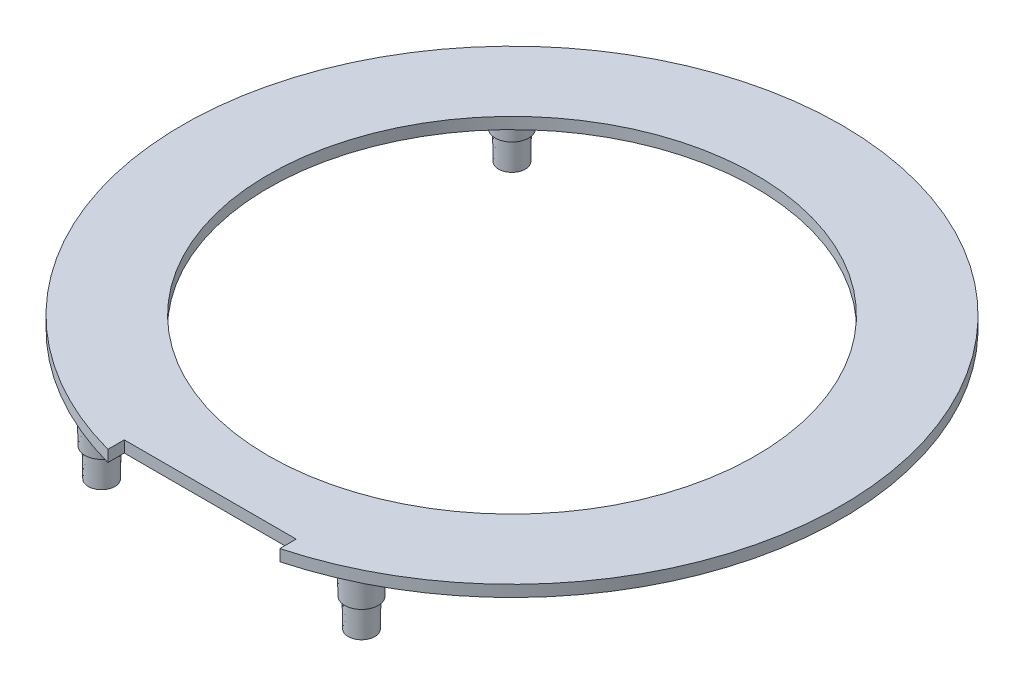
ISO-10303-21;
HEADER;
FILE_DESCRIPTION(('STEP AP214'),'2;1');
FILE_NAME('part.step','',(''),(''),'','','');
FILE_SCHEMA(('AUTOMOTIVE_DESIGN { 1 0 10303 214 1 1 1 1 }'));
ENDSEC;
DATA;
#1=APPLICATION_CONTEXT('core data for automotive mechanical design processes');
#2=APPLICATION_PROTOCOL_DEFINITION('international standard','automotive_design',2000,#1);
#3=PRODUCT_CONTEXT('',#1,'mechanical');
#4=PRODUCT('Part','Part','',(#3));
#5=PRODUCT_RELATED_PRODUCT_CATEGORY('part','',(#4));
#6=PRODUCT_DEFINITION_FORMATION('','',#4);
#7=PRODUCT_DEFINITION_CONTEXT('part definition',#1,'design');
#8=PRODUCT_DEFINITION('design','',#6,#7);
#9=PRODUCT_DEFINITION_SHAPE('','',#8);
#10=(LENGTH_UNIT() NAMED_UNIT(*) SI_UNIT(.MILLI.,.METRE.));
#11=(NAMED_UNIT(*) PLANE_ANGLE_UNIT() SI_UNIT($,.RADIAN.));
#12=(NAMED_UNIT(*) SI_UNIT($,.STERADIAN.) SOLID_ANGLE_UNIT());
#13=UNCERTAINTY_MEASURE_WITH_UNIT(LENGTH_MEASURE(1.E-05),#10,'distance_accuracy_value','');
#14=(GEOMETRIC_REPRESENTATION_CONTEXT(3) GLOBAL_UNCERTAINTY_ASSIGNED_CONTEXT((#13)) GLOBAL_UNIT_ASSIGNED_CONTEXT((#10,
#11,#12)) REPRESENTATION_CONTEXT('',''));
#15=CARTESIAN_POINT('',(0.,0.,0.));
#16=DIRECTION('',(0.,0.,1.));
#17=DIRECTION('',(1.,0.,0.));
#18=AXIS2_PLACEMENT_3D('',#15,#16,#17);
#19=CARTESIAN_POINT('',(0.,0.4,-1.53064501));
#20=DIRECTION('',(0.,1.,0.));
#21=DIRECTION('',(0.,0.,1.));
#22=AXIS2_PLACEMENT_3D('',#19,#20,#21);
#23=PLANE('',#22);
#24=DIRECTION('',(0.,0.,1.));
#25=VECTOR('',#24,1.);
#26=CARTESIAN_POINT('',(-3.,0.4,9.));
#27=LINE('',#26,#25);
#28=CARTESIAN_POINT('',(-3.,0.4,9.));
#29=VERTEX_POINT('',#28);
#30=CARTESIAN_POINT('',(-3.,0.4,9.57115664558726));
#31=VERTEX_POINT('',#30);
#32=EDGE_CURVE('E87',#29,#31,#27,.T.);
#33=ORIENTED_EDGE('',*,*,#32,.F.);
#34=DIRECTION('',(-1.,0.,0.));
#35=VECTOR('',#34,1.);
#36=CARTESIAN_POINT('',(3.,0.4,9.));
#37=LINE('',#36,#35);
#38=CARTESIAN_POINT('',(3.,0.4,9.));
#39=VERTEX_POINT('',#38);
#40=EDGE_CURVE('E95',#39,#29,#37,.T.);
#41=ORIENTED_EDGE('',*,*,#40,.F.);
#42=DIRECTION('',(0.,0.,-1.));
#43=VECTOR('',#42,1.);
#44=CARTESIAN_POINT('',(3.,0.4,9.));
#45=LINE('',#44,#43);
#46=CARTESIAN_POINT('',(3.,0.4,9.57115664558726));
#47=VERTEX_POINT('',#46);
#48=EDGE_CURVE('E80',#47,#39,#45,.T.);
#49=ORIENTED_EDGE('',*,*,#48,.F.);
#50=CARTESIAN_POINT('',(0.,0.4,-1.53064501));
#51=DIRECTION('',(0.,1.,0.));
#52=DIRECTION('',(0.,0.,1.));
#53=AXIS2_PLACEMENT_3D('',#50,#51,#52);
#54=CIRCLE('',#53,11.5);
#55=EDGE_CURVE('E93',#47,#31,#54,.T.);
#56=ORIENTED_EDGE('',*,*,#55,.T.);
#57=EDGE_LOOP('',(#33,#41,#49,#56));
#58=FACE_BOUND('',#57,.T.);
#59=CARTESIAN_POINT('',(0.,0.4,-1.53064501));
#60=DIRECTION('',(0.,1.,0.));
#61=DIRECTION('',(0.,0.,1.));
#62=AXIS2_PLACEMENT_3D('',#59,#60,#61);
#63=CIRCLE('',#62,8.5);
#64=CARTESIAN_POINT('',(0.,0.4,6.96935499));
#65=VERTEX_POINT('',#64);
#66=EDGE_CURVE('E106',#65,#65,#63,.T.);
#67=ORIENTED_EDGE('',*,*,#66,.F.);
#68=EDGE_LOOP('',(#67));
#69=FACE_BOUND('',#68,.T.);
#70=ADVANCED_FACE('F35',(#58,#69),#23,.T.);
#71=CARTESIAN_POINT('',(0.,0.,-1.53064501));
#72=DIRECTION('',(0.,1.,0.));
#73=DIRECTION('',(0.,0.,1.));
#74=AXIS2_PLACEMENT_3D('',#71,#72,#73);
#75=PLANE('',#74);
#76=CARTESIAN_POINT('',(4.45412000000001,0.,8.175151));
#77=DIRECTION('',(0.,1.,0.));
#78=DIRECTION('',(0.,0.,-1.));
#79=AXIS2_PLACEMENT_3D('',#76,#77,#78);
#80=CIRCLE('',#79,0.6);
#81=CARTESIAN_POINT('',(4.45412000000001,0.,7.57515100000001));
#82=VERTEX_POINT('',#81);
#83=EDGE_CURVE('E133',#82,#82,#80,.T.);
#84=ORIENTED_EDGE('',*,*,#83,.T.);
#85=EDGE_LOOP('',(#84));
#86=FACE_BOUND('',#85,.T.);
#87=CARTESIAN_POINT('',(7.74411999999999,0.,-8.57484900000001));
#88=DIRECTION('',(0.,1.,0.));
#89=DIRECTION('',(0.,0.,-1.));
#90=AXIS2_PLACEMENT_3D('',#87,#88,#89);
#91=CIRCLE('',#90,0.6);
#92=CARTESIAN_POINT('',(7.74411999999999,0.,-9.17484900000001));
#93=VERTEX_POINT('',#92);
#94=EDGE_CURVE('E138',#93,#93,#91,.T.);
#95=ORIENTED_EDGE('',*,*,#94,.T.);
#96=EDGE_LOOP('',(#95));
#97=FACE_BOUND('',#96,.T.);
#98=CARTESIAN_POINT('',(-7.04588,0.,-8.57484900000001));
#99=DIRECTION('',(0.,1.,0.));
#100=DIRECTION('',(0.,0.,1.));
#101=AXIS2_PLACEMENT_3D('',#98,#99,#100);
#102=CIRCLE('',#101,0.6);
#103=CARTESIAN_POINT('',(-7.04588,0.,-7.97484900000001));
#104=VERTEX_POINT('',#103);
#105=EDGE_CURVE('E128',#104,#104,#102,.T.);
#106=ORIENTED_EDGE('',*,*,#105,.T.);
#107=EDGE_LOOP('',(#106));
#108=FACE_BOUND('',#107,.T.);
#109=CARTESIAN_POINT('',(-4.61587999999999,0.,8.175151));
#110=DIRECTION('',(0.,1.,0.));
#111=DIRECTION('',(0.,0.,1.));
#112=AXIS2_PLACEMENT_3D('',#109,#110,#111);
#113=CIRCLE('',#112,0.6);
#114=CARTESIAN_POINT('',(-4.61587999999999,0.,8.775151));
#115=VERTEX_POINT('',#114);
#116=EDGE_CURVE('E127',#115,#115,#113,.T.);
#117=ORIENTED_EDGE('',*,*,#116,.T.);
#118=EDGE_LOOP('',(#117));
#119=FACE_BOUND('',#118,.T.);
#120=DIRECTION('',(1.,0.,0.));
#121=VECTOR('',#120,1.);
#122=CARTESIAN_POINT('',(3.,0.,9.));
#123=LINE('',#122,#121);
#124=CARTESIAN_POINT('',(-3.,0.,9.));
#125=VERTEX_POINT('',#124);
#126=CARTESIAN_POINT('',(3.,0.,9.));
#127=VERTEX_POINT('',#126);
#128=EDGE_CURVE('E223',#125,#127,#123,.T.);
#129=ORIENTED_EDGE('',*,*,#128,.F.);
#130=DIRECTION('',(0.,0.,-1.));
#131=VECTOR('',#130,1.);
#132=CARTESIAN_POINT('',(-3.,0.,9.));
#133=LINE('',#132,#131);
#134=CARTESIAN_POINT('',(-3.,0.,9.57115664558726));
#135=VERTEX_POINT('',#134);
#136=EDGE_CURVE('E61',#135,#125,#133,.T.);
#137=ORIENTED_EDGE('',*,*,#136,.F.);
#138=CARTESIAN_POINT('',(0.,0.,-1.53064501));
#139=DIRECTION('',(0.,1.,0.));
#140=DIRECTION('',(0.,0.,1.));
#141=AXIS2_PLACEMENT_3D('',#138,#139,#140);
#142=CIRCLE('',#141,11.5);
#143=CARTESIAN_POINT('',(3.,0.,9.57115664558726));
#144=VERTEX_POINT('',#143);
#145=EDGE_CURVE('E101',#144,#135,#142,.T.);
#146=ORIENTED_EDGE('',*,*,#145,.F.);
#147=DIRECTION('',(0.,0.,1.));
#148=VECTOR('',#147,1.);
#149=CARTESIAN_POINT('',(3.,0.,9.));
#150=LINE('',#149,#148);
#151=EDGE_CURVE('E52',#127,#144,#150,.T.);
#152=ORIENTED_EDGE('',*,*,#151,.F.);
#153=EDGE_LOOP('',(#129,#137,#146,#152));
#154=FACE_BOUND('',#153,.T.);
#155=CARTESIAN_POINT('',(0.,0.,-1.53064501));
#156=DIRECTION('',(0.,1.,0.));
#157=DIRECTION('',(0.,0.,1.));
#158=AXIS2_PLACEMENT_3D('',#155,#156,#157);
#159=CIRCLE('',#158,8.5);
#160=CARTESIAN_POINT('',(0.,0.,6.96935499));
#161=VERTEX_POINT('',#160);
#162=EDGE_CURVE('E109',#161,#161,#159,.T.);
#163=ORIENTED_EDGE('',*,*,#162,.T.);
#164=EDGE_LOOP('',(#163));
#165=FACE_BOUND('',#164,.T.);
#166=ADVANCED_FACE('F158',(#86,#97,#108,#119,#154,#165),#75,.F.);
#167=CARTESIAN_POINT('',(0.,0.4,-1.53064501));
#168=DIRECTION('',(0.,-1.,0.));
#169=DIRECTION('',(0.,0.,-1.));
#170=AXIS2_PLACEMENT_3D('',#167,#168,#169);
#171=CYLINDRICAL_SURFACE('',#170,11.5);
#172=ORIENTED_EDGE('',*,*,#145,.T.);
#173=DIRECTION('',(0.,1.,0.));
#174=VECTOR('',#173,1.);
#175=CARTESIAN_POINT('',(-3.,-6.07779969204628,9.57115664558726));
#176=LINE('',#175,#174);
#177=EDGE_CURVE('E99',#135,#31,#176,.T.);
#178=ORIENTED_EDGE('',*,*,#177,.T.);
#179=ORIENTED_EDGE('',*,*,#55,.F.);
#180=DIRECTION('',(0.,1.,0.));
#181=VECTOR('',#180,1.);
#182=CARTESIAN_POINT('',(3.,-6.07779969204628,9.57115664558726));
#183=LINE('',#182,#181);
#184=EDGE_CURVE('E77',#144,#47,#183,.T.);
#185=ORIENTED_EDGE('',*,*,#184,.F.);
#186=EDGE_LOOP('',(#172,#178,#179,#185));
#187=FACE_BOUND('',#186,.T.);
#188=ADVANCED_FACE('F98',(#187),#171,.T.);
#189=CARTESIAN_POINT('',(0.,0.4,-1.53064501));
#190=DIRECTION('',(0.,-1.,0.));
#191=DIRECTION('',(0.,0.,-1.));
#192=AXIS2_PLACEMENT_3D('',#189,#190,#191);
#193=CYLINDRICAL_SURFACE('',#192,8.5);
#194=ORIENTED_EDGE('',*,*,#66,.T.);
#195=EDGE_LOOP('',(#194));
#196=FACE_BOUND('',#195,.T.);
#197=ORIENTED_EDGE('',*,*,#162,.F.);
#198=EDGE_LOOP('',(#197));
#199=FACE_BOUND('',#198,.T.);
#200=ADVANCED_FACE('F160',(#196,#199),#193,.F.);
#201=CARTESIAN_POINT('',(-4.61587999999999,0.,8.175151));
#202=DIRECTION('',(0.,1.,0.));
#203=DIRECTION('',(0.,0.,-1.));
#204=AXIS2_PLACEMENT_3D('',#201,#202,#203);
#205=CONICAL_SURFACE('',#204,0.6,0.0174532925199433);
#206=CARTESIAN_POINT('',(-4.61587999999999,-1.,8.175151));
#207=DIRECTION('',(0.,1.,0.));
#208=DIRECTION('',(0.,0.,1.));
#209=AXIS2_PLACEMENT_3D('',#206,#207,#208);
#210=CIRCLE('',#209,0.582544935071783);
#211=CARTESIAN_POINT('',(-4.61587999999999,-1.,8.75769593507179));
#212=VERTEX_POINT('',#211);
#213=EDGE_CURVE('E129',#212,#212,#210,.T.);
#214=ORIENTED_EDGE('',*,*,#213,.T.);
#215=EDGE_LOOP('',(#214));
#216=FACE_BOUND('',#215,.T.);
#217=ORIENTED_EDGE('',*,*,#116,.F.);
#218=EDGE_LOOP('',(#217));
#219=FACE_BOUND('',#218,.T.);
#220=ADVANCED_FACE('F162',(#216,#219),#205,.T.);
#221=CARTESIAN_POINT('',(-4.61587999999999,-1.,8.175151));
#222=DIRECTION('',(0.,1.,0.));
#223=DIRECTION('',(0.,0.,1.));
#224=AXIS2_PLACEMENT_3D('',#221,#222,#223);
#225=PLANE('',#224);
#226=CARTESIAN_POINT('',(-4.61587999999999,-1.,8.175151));
#227=DIRECTION('',(0.,1.,0.));
#228=DIRECTION('',(0.,0.,1.));
#229=AXIS2_PLACEMENT_3D('',#226,#227,#228);
#230=CIRCLE('',#229,0.482544935071784);
#231=CARTESIAN_POINT('',(-4.61587999999999,-1.,8.65769593507179));
#232=VERTEX_POINT('',#231);
#233=EDGE_CURVE('E100',#232,#232,#230,.F.);
#234=ORIENTED_EDGE('',*,*,#233,.F.);
#235=EDGE_LOOP('',(#234));
#236=FACE_BOUND('',#235,.T.);
#237=ORIENTED_EDGE('',*,*,#213,.F.);
#238=EDGE_LOOP('',(#237));
#239=FACE_BOUND('',#238,.T.);
#240=ADVANCED_FACE('F168',(#236,#239),#225,.F.);
#241=CARTESIAN_POINT('',(-7.04588,0.,-8.57484900000001));
#242=DIRECTION('',(0.,1.,0.));
#243=DIRECTION('',(0.,0.,-1.));
#244=AXIS2_PLACEMENT_3D('',#241,#242,#243);
#245=CONICAL_SURFACE('',#244,0.6,0.0174532925199433);
#246=CARTESIAN_POINT('',(-7.04588,-1.,-8.57484900000001));
#247=DIRECTION('',(0.,1.,0.));
#248=DIRECTION('',(0.,0.,1.));
#249=AXIS2_PLACEMENT_3D('',#246,#247,#248);
#250=CIRCLE('',#249,0.582544935071783);
#251=CARTESIAN_POINT('',(-7.04588,-1.,-7.99230406492823));
#252=VERTEX_POINT('',#251);
#253=EDGE_CURVE('E124',#252,#252,#250,.T.);
#254=ORIENTED_EDGE('',*,*,#253,.T.);
#255=EDGE_LOOP('',(#254));
#256=FACE_BOUND('',#255,.T.);
#257=ORIENTED_EDGE('',*,*,#105,.F.);
#258=EDGE_LOOP('',(#257));
#259=FACE_BOUND('',#258,.T.);
#260=ADVANCED_FACE('F205',(#256,#259),#245,.T.);
#261=CARTESIAN_POINT('',(-7.04588,-1.,-8.57484900000001));
#262=DIRECTION('',(0.,1.,0.));
#263=DIRECTION('',(0.,0.,1.));
#264=AXIS2_PLACEMENT_3D('',#261,#262,#263);
#265=PLANE('',#264);
#266=CARTESIAN_POINT('',(-7.04588,-1.,-8.57484900000001));
#267=DIRECTION('',(0.,1.,0.));
#268=DIRECTION('',(0.,0.,1.));
#269=AXIS2_PLACEMENT_3D('',#266,#267,#268);
#270=CIRCLE('',#269,0.482544935071784);
#271=CARTESIAN_POINT('',(-7.04588,-1.,-8.09230406492822));
#272=VERTEX_POINT('',#271);
#273=EDGE_CURVE('E104',#272,#272,#270,.F.);
#274=ORIENTED_EDGE('',*,*,#273,.F.);
#275=EDGE_LOOP('',(#274));
#276=FACE_BOUND('',#275,.T.);
#277=ORIENTED_EDGE('',*,*,#253,.F.);
#278=EDGE_LOOP('',(#277));
#279=FACE_BOUND('',#278,.T.);
#280=ADVANCED_FACE('F190',(#276,#279),#265,.F.);
#281=CARTESIAN_POINT('',(7.74411999999999,0.,-8.57484900000001));
#282=DIRECTION('',(0.,1.,0.));
#283=DIRECTION('',(0.,0.,-1.));
#284=AXIS2_PLACEMENT_3D('',#281,#282,#283);
#285=CONICAL_SURFACE('',#284,0.6,0.0174532925199433);
#286=CARTESIAN_POINT('',(7.74411999999999,-1.,-8.57484900000001));
#287=DIRECTION('',(0.,-1.,0.));
#288=DIRECTION('',(0.,0.,-1.));
#289=AXIS2_PLACEMENT_3D('',#286,#287,#288);
#290=CIRCLE('',#289,0.582544935071783);
#291=CARTESIAN_POINT('',(7.74411999999999,-1.,-9.15739393507179));
#292=VERTEX_POINT('',#291);
#293=EDGE_CURVE('E39',#292,#292,#290,.F.);
#294=ORIENTED_EDGE('',*,*,#293,.T.);
#295=EDGE_LOOP('',(#294));
#296=FACE_BOUND('',#295,.T.);
#297=ORIENTED_EDGE('',*,*,#94,.F.);
#298=EDGE_LOOP('',(#297));
#299=FACE_BOUND('',#298,.T.);
#300=ADVANCED_FACE('F186',(#296,#299),#285,.T.);
#301=CARTESIAN_POINT('',(7.74411999999999,-1.,-8.57484900000001));
#302=DIRECTION('',(0.,-1.,0.));
#303=DIRECTION('',(0.,0.,-1.));
#304=AXIS2_PLACEMENT_3D('',#301,#302,#303);
#305=PLANE('',#304);
#306=CARTESIAN_POINT('',(7.74411999999999,-1.,-8.57484900000001));
#307=DIRECTION('',(0.,-1.,0.));
#308=DIRECTION('',(0.,0.,-1.));
#309=AXIS2_PLACEMENT_3D('',#306,#307,#308);
#310=CIRCLE('',#309,0.482544935071785);
#311=CARTESIAN_POINT('',(7.74411999999999,-1.,-9.0573939350718));
#312=VERTEX_POINT('',#311);
#313=EDGE_CURVE('E44',#312,#312,#310,.T.);
#314=ORIENTED_EDGE('',*,*,#313,.F.);
#315=EDGE_LOOP('',(#314));
#316=FACE_BOUND('',#315,.T.);
#317=ORIENTED_EDGE('',*,*,#293,.F.);
#318=EDGE_LOOP('',(#317));
#319=FACE_BOUND('',#318,.T.);
#320=ADVANCED_FACE('F189',(#316,#319),#305,.T.);
#321=CARTESIAN_POINT('',(4.45412000000001,0.,8.175151));
#322=DIRECTION('',(0.,1.,0.));
#323=DIRECTION('',(0.,0.,-1.));
#324=AXIS2_PLACEMENT_3D('',#321,#322,#323);
#325=CONICAL_SURFACE('',#324,0.6,0.0174532925199433);
#326=CARTESIAN_POINT('',(4.45412000000001,-1.,8.175151));
#327=DIRECTION('',(0.,-1.,0.));
#328=DIRECTION('',(0.,0.,-1.));
#329=AXIS2_PLACEMENT_3D('',#326,#327,#328);
#330=CIRCLE('',#329,0.582544935071783);
#331=CARTESIAN_POINT('',(4.45412000000001,-1.,7.59260606492822));
#332=VERTEX_POINT('',#331);
#333=EDGE_CURVE('E136',#332,#332,#330,.F.);
#334=ORIENTED_EDGE('',*,*,#333,.T.);
#335=EDGE_LOOP('',(#334));
#336=FACE_BOUND('',#335,.T.);
#337=ORIENTED_EDGE('',*,*,#83,.F.);
#338=EDGE_LOOP('',(#337));
#339=FACE_BOUND('',#338,.T.);
#340=ADVANCED_FACE('F192',(#336,#339),#325,.T.);
#341=CARTESIAN_POINT('',(4.45412000000001,-1.,8.175151));
#342=DIRECTION('',(0.,-1.,0.));
#343=DIRECTION('',(0.,0.,-1.));
#344=AXIS2_PLACEMENT_3D('',#341,#342,#343);
#345=PLANE('',#344);
#346=CARTESIAN_POINT('',(4.45412000000001,-1.,8.175151));
#347=DIRECTION('',(0.,-1.,0.));
#348=DIRECTION('',(0.,0.,-1.));
#349=AXIS2_PLACEMENT_3D('',#346,#347,#348);
#350=CIRCLE('',#349,0.482544935071784);
#351=CARTESIAN_POINT('',(4.45412000000001,-1.,7.69260606492822));
#352=VERTEX_POINT('',#351);
#353=EDGE_CURVE('E11',#352,#352,#350,.T.);
#354=ORIENTED_EDGE('',*,*,#353,.F.);
#355=EDGE_LOOP('',(#354));
#356=FACE_BOUND('',#355,.T.);
#357=ORIENTED_EDGE('',*,*,#333,.F.);
#358=EDGE_LOOP('',(#357));
#359=FACE_BOUND('',#358,.T.);
#360=ADVANCED_FACE('F195',(#356,#359),#345,.T.);
#361=CARTESIAN_POINT('',(-4.61587999999999,0.,8.175151));
#362=DIRECTION('',(0.,1.,0.));
#363=DIRECTION('',(0.,0.,-1.));
#364=AXIS2_PLACEMENT_3D('',#361,#362,#363);
#365=CONICAL_SURFACE('',#364,0.500000000000002,0.0174532925199433);
#366=CARTESIAN_POINT('',(-4.61587999999999,-2.,8.175151));
#367=DIRECTION('',(0.,-1.,0.));
#368=DIRECTION('',(0.,0.,-1.));
#369=AXIS2_PLACEMENT_3D('',#366,#367,#368);
#370=CIRCLE('',#369,0.465089870143566);
#371=CARTESIAN_POINT('',(-4.61587999999999,-2.,7.71006112985644));
#372=VERTEX_POINT('',#371);
#373=EDGE_CURVE('E121',#372,#372,#370,.T.);
#374=ORIENTED_EDGE('',*,*,#373,.F.);
#375=EDGE_LOOP('',(#374));
#376=FACE_BOUND('',#375,.T.);
#377=ORIENTED_EDGE('',*,*,#233,.T.);
#378=EDGE_LOOP('',(#377));
#379=FACE_BOUND('',#378,.T.);
#380=ADVANCED_FACE('F201',(#376,#379),#365,.T.);
#381=CARTESIAN_POINT('',(-4.61587999999999,-2.,8.175151));
#382=DIRECTION('',(0.,-1.,0.));
#383=DIRECTION('',(0.,0.,-1.));
#384=AXIS2_PLACEMENT_3D('',#381,#382,#383);
#385=PLANE('',#384);
#386=ORIENTED_EDGE('',*,*,#373,.T.);
#387=EDGE_LOOP('',(#386));
#388=FACE_BOUND('',#387,.T.);
#389=ADVANCED_FACE('F203',(#388),#385,.T.);
#390=CARTESIAN_POINT('',(-7.04588,0.,-8.57484900000001));
#391=DIRECTION('',(0.,1.,0.));
#392=DIRECTION('',(0.,0.,-1.));
#393=AXIS2_PLACEMENT_3D('',#390,#391,#392);
#394=CONICAL_SURFACE('',#393,0.500000000000002,0.0174532925199433);
#395=CARTESIAN_POINT('',(-7.04588,-2.,-8.57484900000001));
#396=DIRECTION('',(0.,-1.,0.));
#397=DIRECTION('',(0.,0.,-1.));
#398=AXIS2_PLACEMENT_3D('',#395,#396,#397);
#399=CIRCLE('',#398,0.465089870143566);
#400=CARTESIAN_POINT('',(-7.04588,-2.,-9.03993887014358));
#401=VERTEX_POINT('',#400);
#402=EDGE_CURVE('E115',#401,#401,#399,.T.);
#403=ORIENTED_EDGE('',*,*,#402,.F.);
#404=EDGE_LOOP('',(#403));
#405=FACE_BOUND('',#404,.T.);
#406=ORIENTED_EDGE('',*,*,#273,.T.);
#407=EDGE_LOOP('',(#406));
#408=FACE_BOUND('',#407,.T.);
#409=ADVANCED_FACE('F37',(#405,#408),#394,.T.);
#410=CARTESIAN_POINT('',(-7.04588,-2.,-8.57484900000001));
#411=DIRECTION('',(0.,-1.,0.));
#412=DIRECTION('',(0.,0.,-1.));
#413=AXIS2_PLACEMENT_3D('',#410,#411,#412);
#414=PLANE('',#413);
#415=ORIENTED_EDGE('',*,*,#402,.T.);
#416=EDGE_LOOP('',(#415));
#417=FACE_BOUND('',#416,.T.);
#418=ADVANCED_FACE('F184',(#417),#414,.T.);
#419=CARTESIAN_POINT('',(7.74411999999999,0.,-8.57484900000001));
#420=DIRECTION('',(0.,1.,0.));
#421=DIRECTION('',(0.,0.,-1.));
#422=AXIS2_PLACEMENT_3D('',#419,#420,#421);
#423=CONICAL_SURFACE('',#422,0.500000000000003,0.0174532925199433);
#424=CARTESIAN_POINT('',(7.74411999999999,-2.,-8.57484900000001));
#425=DIRECTION('',(0.,1.,0.));
#426=DIRECTION('',(0.,0.,1.));
#427=AXIS2_PLACEMENT_3D('',#424,#425,#426);
#428=CIRCLE('',#427,0.465089870143567);
#429=CARTESIAN_POINT('',(7.74411999999999,-2.,-8.10975912985644));
#430=VERTEX_POINT('',#429);
#431=EDGE_CURVE('E112',#430,#430,#428,.F.);
#432=ORIENTED_EDGE('',*,*,#431,.F.);
#433=EDGE_LOOP('',(#432));
#434=FACE_BOUND('',#433,.T.);
#435=ORIENTED_EDGE('',*,*,#313,.T.);
#436=EDGE_LOOP('',(#435));
#437=FACE_BOUND('',#436,.T.);
#438=ADVANCED_FACE('F180',(#434,#437),#423,.T.);
#439=CARTESIAN_POINT('',(7.74411999999999,-2.,-8.57484900000001));
#440=DIRECTION('',(0.,1.,0.));
#441=DIRECTION('',(0.,0.,1.));
#442=AXIS2_PLACEMENT_3D('',#439,#440,#441);
#443=PLANE('',#442);
#444=ORIENTED_EDGE('',*,*,#431,.T.);
#445=EDGE_LOOP('',(#444));
#446=FACE_BOUND('',#445,.T.);
#447=ADVANCED_FACE('F183',(#446),#443,.F.);
#448=CARTESIAN_POINT('',(4.45412000000001,0.,8.175151));
#449=DIRECTION('',(0.,1.,0.));
#450=DIRECTION('',(0.,0.,-1.));
#451=AXIS2_PLACEMENT_3D('',#448,#449,#450);
#452=CONICAL_SURFACE('',#451,0.500000000000002,0.0174532925199433);
#453=CARTESIAN_POINT('',(4.45412000000001,-2.,8.175151));
#454=DIRECTION('',(0.,1.,0.));
#455=DIRECTION('',(0.,0.,1.));
#456=AXIS2_PLACEMENT_3D('',#453,#454,#455);
#457=CIRCLE('',#456,0.465089870143566);
#458=CARTESIAN_POINT('',(4.45412000000001,-2.,8.64024087014357));
#459=VERTEX_POINT('',#458);
#460=EDGE_CURVE('E116',#459,#459,#457,.F.);
#461=ORIENTED_EDGE('',*,*,#460,.F.);
#462=EDGE_LOOP('',(#461));
#463=FACE_BOUND('',#462,.T.);
#464=ORIENTED_EDGE('',*,*,#353,.T.);
#465=EDGE_LOOP('',(#464));
#466=FACE_BOUND('',#465,.T.);
#467=ADVANCED_FACE('F196',(#463,#466),#452,.T.);
#468=CARTESIAN_POINT('',(4.45412000000001,-2.,8.175151));
#469=DIRECTION('',(0.,1.,0.));
#470=DIRECTION('',(0.,0.,1.));
#471=AXIS2_PLACEMENT_3D('',#468,#469,#470);
#472=PLANE('',#471);
#473=ORIENTED_EDGE('',*,*,#460,.T.);
#474=EDGE_LOOP('',(#473));
#475=FACE_BOUND('',#474,.T.);
#476=ADVANCED_FACE('F199',(#475),#472,.F.);
#477=CARTESIAN_POINT('',(-3.,-6.07779969204628,9.));
#478=DIRECTION('',(-1.,0.,0.));
#479=DIRECTION('',(0.,0.,1.));
#480=AXIS2_PLACEMENT_3D('',#477,#478,#479);
#481=PLANE('',#480);
#482=ORIENTED_EDGE('',*,*,#136,.T.);
#483=DIRECTION('',(0.,1.,0.));
#484=VECTOR('',#483,1.);
#485=CARTESIAN_POINT('',(-3.,-6.07779969204628,9.));
#486=LINE('',#485,#484);
#487=EDGE_CURVE('E227',#125,#29,#486,.T.);
#488=ORIENTED_EDGE('',*,*,#487,.T.);
#489=ORIENTED_EDGE('',*,*,#32,.T.);
#490=ORIENTED_EDGE('',*,*,#177,.F.);
#491=EDGE_LOOP('',(#482,#488,#489,#490));
#492=FACE_BOUND('',#491,.T.);
#493=ADVANCED_FACE('F234',(#492),#481,.F.);
#494=CARTESIAN_POINT('',(3.,-6.07779969204628,9.));
#495=DIRECTION('',(0.,0.,-1.));
#496=DIRECTION('',(-1.,0.,0.));
#497=AXIS2_PLACEMENT_3D('',#494,#495,#496);
#498=PLANE('',#497);
#499=ORIENTED_EDGE('',*,*,#128,.T.);
#500=DIRECTION('',(0.,1.,0.));
#501=VECTOR('',#500,1.);
#502=CARTESIAN_POINT('',(3.,-6.07779969204628,9.));
#503=LINE('',#502,#501);
#504=EDGE_CURVE('E86',#127,#39,#503,.T.);
#505=ORIENTED_EDGE('',*,*,#504,.T.);
#506=ORIENTED_EDGE('',*,*,#40,.T.);
#507=ORIENTED_EDGE('',*,*,#487,.F.);
#508=EDGE_LOOP('',(#499,#505,#506,#507));
#509=FACE_BOUND('',#508,.T.);
#510=ADVANCED_FACE('F233',(#509),#498,.F.);
#511=CARTESIAN_POINT('',(3.,-6.07779969204628,9.));
#512=DIRECTION('',(1.,0.,0.));
#513=DIRECTION('',(0.,0.,-1.));
#514=AXIS2_PLACEMENT_3D('',#511,#512,#513);
#515=PLANE('',#514);
#516=ORIENTED_EDGE('',*,*,#151,.T.);
#517=ORIENTED_EDGE('',*,*,#184,.T.);
#518=ORIENTED_EDGE('',*,*,#48,.T.);
#519=ORIENTED_EDGE('',*,*,#504,.F.);
#520=EDGE_LOOP('',(#516,#517,#518,#519));
#521=FACE_BOUND('',#520,.T.);
#522=ADVANCED_FACE('F79',(#521),#515,.F.);
#523=CLOSED_SHELL('',(#70,#166,#188,#200,#220,#240,#260,#280,#300,#320,#340,#360,#380,#389,#409,
#418,#438,#447,#467,#476,#493,#510,#522));
#524=MANIFOLD_SOLID_BREP('B2',#523);
#525=ADVANCED_BREP_SHAPE_REPRESENTATION('',(#18,#524),#14);
#526=SHAPE_DEFINITION_REPRESENTATION(#9,#525);
ENDSEC;
END-ISO-10303-21;
